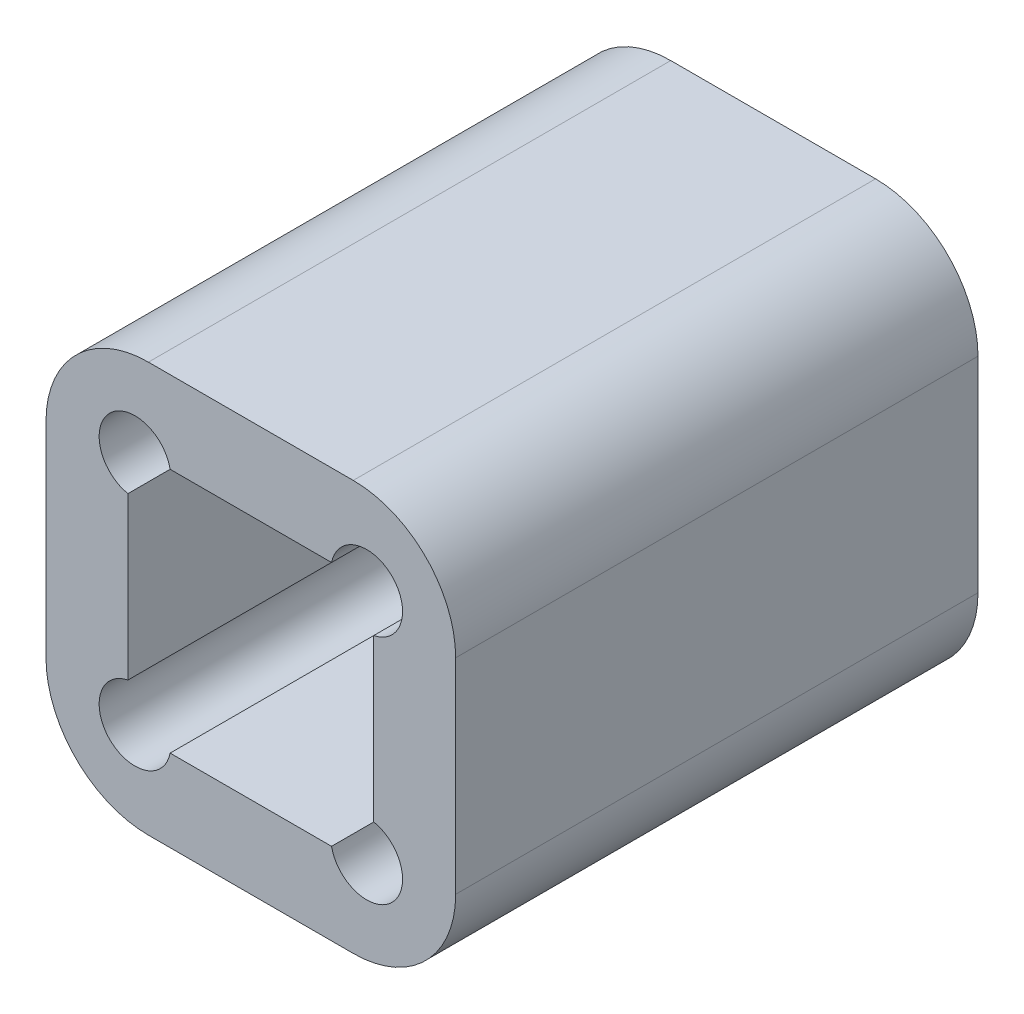
ISO-10303-21;
HEADER;
FILE_DESCRIPTION(('STEP AP214'),'2;1');
FILE_NAME('part.step','',(''),(''),'','','');
FILE_SCHEMA(('AUTOMOTIVE_DESIGN { 1 0 10303 214 1 1 1 1 }'));
ENDSEC;
DATA;
#1=APPLICATION_CONTEXT('core data for automotive mechanical design processes');
#2=APPLICATION_PROTOCOL_DEFINITION('international standard','automotive_design',2000,#1);
#3=PRODUCT_CONTEXT('',#1,'mechanical');
#4=PRODUCT('Part','Part','',(#3));
#5=PRODUCT_RELATED_PRODUCT_CATEGORY('part','',(#4));
#6=PRODUCT_DEFINITION_FORMATION('','',#4);
#7=PRODUCT_DEFINITION_CONTEXT('part definition',#1,'design');
#8=PRODUCT_DEFINITION('design','',#6,#7);
#9=PRODUCT_DEFINITION_SHAPE('','',#8);
#10=(LENGTH_UNIT() NAMED_UNIT(*) SI_UNIT(.MILLI.,.METRE.));
#11=(NAMED_UNIT(*) PLANE_ANGLE_UNIT() SI_UNIT($,.RADIAN.));
#12=(NAMED_UNIT(*) SI_UNIT($,.STERADIAN.) SOLID_ANGLE_UNIT());
#13=UNCERTAINTY_MEASURE_WITH_UNIT(LENGTH_MEASURE(1.E-05),#10,'distance_accuracy_value','');
#14=(GEOMETRIC_REPRESENTATION_CONTEXT(3) GLOBAL_UNCERTAINTY_ASSIGNED_CONTEXT((#13)) GLOBAL_UNIT_ASSIGNED_CONTEXT((#10,
#11,#12)) REPRESENTATION_CONTEXT('',''));
#15=CARTESIAN_POINT('',(0.,0.,0.));
#16=DIRECTION('',(0.,0.,1.));
#17=DIRECTION('',(1.,0.,0.));
#18=AXIS2_PLACEMENT_3D('',#15,#16,#17);
#19=CARTESIAN_POINT('',(0.,0.,0.));
#20=DIRECTION('',(0.,0.,-1.));
#21=DIRECTION('',(-1.,0.,0.));
#22=AXIS2_PLACEMENT_3D('',#19,#20,#21);
#23=CONICAL_SURFACE('',#22,3.15,0.785398163397448);
#24=CARTESIAN_POINT('',(0.,0.,1.45));
#25=DIRECTION('',(0.,0.,-1.));
#26=DIRECTION('',(-1.,0.,0.));
#27=AXIS2_PLACEMENT_3D('',#24,#25,#26);
#28=CIRCLE('',#27,1.7);
#29=CARTESIAN_POINT('',(1.7,0.,1.45));
#30=VERTEX_POINT('',#29);
#31=CARTESIAN_POINT('',(-1.7,0.,1.45));
#32=VERTEX_POINT('',#31);
#33=EDGE_CURVE('E41',#30,#32,#28,.T.);
#34=ORIENTED_EDGE('',*,*,#33,.F.);
#35=DIRECTION('',(0.707106781186547,0.,-0.707106781186548));
#36=VECTOR('',#35,1.);
#37=CARTESIAN_POINT('',(3.15,0.,0.));
#38=LINE('',#37,#36);
#39=CARTESIAN_POINT('',(3.15,0.,0.));
#40=VERTEX_POINT('',#39);
#41=EDGE_CURVE('E11',#30,#40,#38,.T.);
#42=ORIENTED_EDGE('',*,*,#41,.T.);
#43=CARTESIAN_POINT('',(0.,0.,0.));
#44=DIRECTION('',(0.,0.,-1.));
#45=DIRECTION('',(-1.,0.,0.));
#46=AXIS2_PLACEMENT_3D('',#43,#44,#45);
#47=CIRCLE('',#46,3.15);
#48=CARTESIAN_POINT('',(-3.15,0.,0.));
#49=VERTEX_POINT('',#48);
#50=EDGE_CURVE('E27',#40,#49,#47,.T.);
#51=ORIENTED_EDGE('',*,*,#50,.T.);
#52=DIRECTION('',(-0.707106781186547,0.,-0.707106781186548));
#53=VECTOR('',#52,1.);
#54=CARTESIAN_POINT('',(-3.15,0.,0.));
#55=LINE('',#54,#53);
#56=EDGE_CURVE('E209',#32,#49,#55,.T.);
#57=ORIENTED_EDGE('',*,*,#56,.F.);
#58=EDGE_LOOP('',(#34,#42,#51,#57));
#59=FACE_BOUND('',#58,.T.);
#60=ADVANCED_FACE('F16',(#59),#23,.F.);
#61=CARTESIAN_POINT('',(0.,0.,0.));
#62=DIRECTION('',(0.,0.,-1.));
#63=DIRECTION('',(-1.,0.,0.));
#64=AXIS2_PLACEMENT_3D('',#61,#62,#63);
#65=CYLINDRICAL_SURFACE('',#64,1.7);
#66=CARTESIAN_POINT('',(0.,0.,4.75));
#67=DIRECTION('',(0.,0.,-1.));
#68=DIRECTION('',(-1.,0.,0.));
#69=AXIS2_PLACEMENT_3D('',#66,#67,#68);
#70=CIRCLE('',#69,1.7);
#71=CARTESIAN_POINT('',(1.7,0.,4.75));
#72=VERTEX_POINT('',#71);
#73=CARTESIAN_POINT('',(-1.7,0.,4.75));
#74=VERTEX_POINT('',#73);
#75=EDGE_CURVE('E275',#72,#74,#70,.T.);
#76=ORIENTED_EDGE('',*,*,#75,.F.);
#77=DIRECTION('',(0.,0.,-1.));
#78=VECTOR('',#77,1.);
#79=CARTESIAN_POINT('',(1.7,0.,0.));
#80=LINE('',#79,#78);
#81=EDGE_CURVE('E234',#72,#30,#80,.T.);
#82=ORIENTED_EDGE('',*,*,#81,.T.);
#83=ORIENTED_EDGE('',*,*,#33,.T.);
#84=DIRECTION('',(0.,0.,-1.));
#85=VECTOR('',#84,1.);
#86=CARTESIAN_POINT('',(-1.7,0.,0.));
#87=LINE('',#86,#85);
#88=EDGE_CURVE('E223',#74,#32,#87,.T.);
#89=ORIENTED_EDGE('',*,*,#88,.F.);
#90=EDGE_LOOP('',(#76,#82,#83,#89));
#91=FACE_BOUND('',#90,.T.);
#92=ADVANCED_FACE('F233',(#91),#65,.F.);
#93=CARTESIAN_POINT('',(2.82842712474619,-2.82842712474619,2.27512626584708));
#94=DIRECTION('',(0.,0.,1.));
#95=DIRECTION('',(1.,0.,0.));
#96=AXIS2_PLACEMENT_3D('',#93,#94,#95);
#97=CYLINDRICAL_SURFACE('',#96,0.875);
#98=CARTESIAN_POINT('',(2.82842712474619,-2.82842712474619,4.75));
#99=DIRECTION('',(0.,0.,1.));
#100=DIRECTION('',(-1.,0.,0.));
#101=AXIS2_PLACEMENT_3D('',#98,#99,#100);
#102=CIRCLE('',#101,0.875);
#103=CARTESIAN_POINT('',(3.70342712474619,-2.82842712474619,4.75));
#104=VERTEX_POINT('',#103);
#105=CARTESIAN_POINT('',(3.,-1.97041328541891,4.75));
#106=VERTEX_POINT('',#105);
#107=EDGE_CURVE('E333',#104,#106,#102,.T.);
#108=ORIENTED_EDGE('',*,*,#107,.F.);
#109=DIRECTION('',(0.,0.,1.));
#110=VECTOR('',#109,1.);
#111=CARTESIAN_POINT('',(3.70342712474619,-2.82842712474619,2.27512626584708));
#112=LINE('',#111,#110);
#113=CARTESIAN_POINT('',(3.70342712474619,-2.82842712474619,12.75));
#114=VERTEX_POINT('',#113);
#115=EDGE_CURVE('E237',#104,#114,#112,.T.);
#116=ORIENTED_EDGE('',*,*,#115,.T.);
#117=CARTESIAN_POINT('',(2.82842712474619,-2.82842712474619,12.75));
#118=DIRECTION('',(0.,0.,1.));
#119=DIRECTION('',(1.,0.,0.));
#120=AXIS2_PLACEMENT_3D('',#117,#118,#119);
#121=CIRCLE('',#120,0.875);
#122=CARTESIAN_POINT('',(3.,-1.97041328541891,12.75));
#123=VERTEX_POINT('',#122);
#124=EDGE_CURVE('E250',#114,#123,#121,.T.);
#125=ORIENTED_EDGE('',*,*,#124,.T.);
#126=DIRECTION('',(0.,0.,1.));
#127=VECTOR('',#126,1.);
#128=CARTESIAN_POINT('',(3.,-1.97041328541891,2.27512626584708));
#129=LINE('',#128,#127);
#130=EDGE_CURVE('E344',#106,#123,#129,.T.);
#131=ORIENTED_EDGE('',*,*,#130,.F.);
#132=EDGE_LOOP('',(#108,#116,#125,#131));
#133=FACE_BOUND('',#132,.T.);
#134=ADVANCED_FACE('F482',(#133),#97,.F.);
#135=CARTESIAN_POINT('',(2.82842712474619,2.82842712474619,2.27512626584708));
#136=DIRECTION('',(0.,0.,1.));
#137=DIRECTION('',(1.,0.,0.));
#138=AXIS2_PLACEMENT_3D('',#135,#136,#137);
#139=CYLINDRICAL_SURFACE('',#138,0.875);
#140=CARTESIAN_POINT('',(2.82842712474619,2.82842712474619,4.75));
#141=DIRECTION('',(0.,0.,1.));
#142=DIRECTION('',(-1.,0.,0.));
#143=AXIS2_PLACEMENT_3D('',#140,#141,#142);
#144=CIRCLE('',#143,0.875);
#145=CARTESIAN_POINT('',(3.70342712474619,2.82842712474619,4.75));
#146=VERTEX_POINT('',#145);
#147=CARTESIAN_POINT('',(1.97041328541891,3.,4.75));
#148=VERTEX_POINT('',#147);
#149=EDGE_CURVE('E323',#146,#148,#144,.T.);
#150=ORIENTED_EDGE('',*,*,#149,.F.);
#151=DIRECTION('',(0.,0.,1.));
#152=VECTOR('',#151,1.);
#153=CARTESIAN_POINT('',(3.70342712474619,2.82842712474619,2.27512626584708));
#154=LINE('',#153,#152);
#155=CARTESIAN_POINT('',(3.70342712474619,2.82842712474619,12.75));
#156=VERTEX_POINT('',#155);
#157=EDGE_CURVE('E253',#146,#156,#154,.T.);
#158=ORIENTED_EDGE('',*,*,#157,.T.);
#159=CARTESIAN_POINT('',(2.82842712474619,2.82842712474619,12.75));
#160=DIRECTION('',(0.,0.,1.));
#161=DIRECTION('',(1.,0.,0.));
#162=AXIS2_PLACEMENT_3D('',#159,#160,#161);
#163=CIRCLE('',#162,0.875);
#164=CARTESIAN_POINT('',(1.97041328541891,3.,12.75));
#165=VERTEX_POINT('',#164);
#166=EDGE_CURVE('E309',#156,#165,#163,.T.);
#167=ORIENTED_EDGE('',*,*,#166,.T.);
#168=DIRECTION('',(0.,0.,1.));
#169=VECTOR('',#168,1.);
#170=CARTESIAN_POINT('',(1.97041328541891,3.,2.27512626584708));
#171=LINE('',#170,#169);
#172=EDGE_CURVE('E297',#148,#165,#171,.T.);
#173=ORIENTED_EDGE('',*,*,#172,.F.);
#174=EDGE_LOOP('',(#150,#158,#167,#173));
#175=FACE_BOUND('',#174,.T.);
#176=ADVANCED_FACE('F494',(#175),#139,.F.);
#177=CARTESIAN_POINT('',(-5.,5.,12.75));
#178=DIRECTION('',(1.,0.,0.));
#179=DIRECTION('',(0.,1.,0.));
#180=AXIS2_PLACEMENT_3D('',#177,#178,#179);
#181=PLANE('',#180);
#182=DIRECTION('',(0.,-1.,0.));
#183=VECTOR('',#182,1.);
#184=CARTESIAN_POINT('',(-5.,5.,0.));
#185=LINE('',#184,#183);
#186=CARTESIAN_POINT('',(-5.,2.5,0.));
#187=VERTEX_POINT('',#186);
#188=CARTESIAN_POINT('',(-5.,-2.5,0.));
#189=VERTEX_POINT('',#188);
#190=EDGE_CURVE('E305',#187,#189,#185,.T.);
#191=ORIENTED_EDGE('',*,*,#190,.T.);
#192=DIRECTION('',(0.,0.,1.));
#193=VECTOR('',#192,1.);
#194=CARTESIAN_POINT('',(-5.,-2.5,12.75));
#195=LINE('',#194,#193);
#196=CARTESIAN_POINT('',(-5.,-2.5,12.75));
#197=VERTEX_POINT('',#196);
#198=EDGE_CURVE('E310',#189,#197,#195,.T.);
#199=ORIENTED_EDGE('',*,*,#198,.T.);
#200=DIRECTION('',(0.,-1.,0.));
#201=VECTOR('',#200,1.);
#202=CARTESIAN_POINT('',(-5.,5.,12.75));
#203=LINE('',#202,#201);
#204=CARTESIAN_POINT('',(-5.,2.5,12.75));
#205=VERTEX_POINT('',#204);
#206=EDGE_CURVE('E283',#205,#197,#203,.T.);
#207=ORIENTED_EDGE('',*,*,#206,.F.);
#208=DIRECTION('',(0.,0.,-1.));
#209=VECTOR('',#208,1.);
#210=CARTESIAN_POINT('',(-5.,2.5,12.75));
#211=LINE('',#210,#209);
#212=EDGE_CURVE('E337',#205,#187,#211,.T.);
#213=ORIENTED_EDGE('',*,*,#212,.T.);
#214=EDGE_LOOP('',(#191,#199,#207,#213));
#215=FACE_BOUND('',#214,.T.);
#216=ADVANCED_FACE('F533',(#215),#181,.F.);
#217=CARTESIAN_POINT('',(5.,-5.,12.75));
#218=DIRECTION('',(0.,1.,0.));
#219=DIRECTION('',(1.,0.,0.));
#220=AXIS2_PLACEMENT_3D('',#217,#218,#219);
#221=PLANE('',#220);
#222=DIRECTION('',(1.,0.,0.));
#223=VECTOR('',#222,1.);
#224=CARTESIAN_POINT('',(5.,-5.,12.75));
#225=LINE('',#224,#223);
#226=CARTESIAN_POINT('',(-2.5,-5.,12.75));
#227=VERTEX_POINT('',#226);
#228=CARTESIAN_POINT('',(2.5,-5.,12.75));
#229=VERTEX_POINT('',#228);
#230=EDGE_CURVE('E301',#227,#229,#225,.T.);
#231=ORIENTED_EDGE('',*,*,#230,.F.);
#232=DIRECTION('',(0.,0.,-1.));
#233=VECTOR('',#232,1.);
#234=CARTESIAN_POINT('',(-2.5,-5.,12.75));
#235=LINE('',#234,#233);
#236=CARTESIAN_POINT('',(-2.5,-5.,0.));
#237=VERTEX_POINT('',#236);
#238=EDGE_CURVE('E384',#227,#237,#235,.T.);
#239=ORIENTED_EDGE('',*,*,#238,.T.);
#240=DIRECTION('',(1.,0.,0.));
#241=VECTOR('',#240,1.);
#242=CARTESIAN_POINT('',(5.,-5.,0.));
#243=LINE('',#242,#241);
#244=CARTESIAN_POINT('',(2.5,-5.,0.));
#245=VERTEX_POINT('',#244);
#246=EDGE_CURVE('E258',#237,#245,#243,.T.);
#247=ORIENTED_EDGE('',*,*,#246,.T.);
#248=DIRECTION('',(0.,0.,1.));
#249=VECTOR('',#248,1.);
#250=CARTESIAN_POINT('',(2.5,-5.,12.75));
#251=LINE('',#250,#249);
#252=EDGE_CURVE('E254',#245,#229,#251,.T.);
#253=ORIENTED_EDGE('',*,*,#252,.T.);
#254=EDGE_LOOP('',(#231,#239,#247,#253));
#255=FACE_BOUND('',#254,.T.);
#256=ADVANCED_FACE('F537',(#255),#221,.F.);
#257=CARTESIAN_POINT('',(5.,5.,12.75));
#258=DIRECTION('',(-1.,0.,0.));
#259=DIRECTION('',(0.,1.,0.));
#260=AXIS2_PLACEMENT_3D('',#257,#258,#259);
#261=PLANE('',#260);
#262=DIRECTION('',(0.,1.,0.));
#263=VECTOR('',#262,1.);
#264=CARTESIAN_POINT('',(5.,5.,0.));
#265=LINE('',#264,#263);
#266=CARTESIAN_POINT('',(5.,-2.5,0.));
#267=VERTEX_POINT('',#266);
#268=CARTESIAN_POINT('',(5.,2.5,0.));
#269=VERTEX_POINT('',#268);
#270=EDGE_CURVE('E259',#267,#269,#265,.T.);
#271=ORIENTED_EDGE('',*,*,#270,.T.);
#272=DIRECTION('',(0.,0.,1.));
#273=VECTOR('',#272,1.);
#274=CARTESIAN_POINT('',(5.,2.5,12.75));
#275=LINE('',#274,#273);
#276=CARTESIAN_POINT('',(5.,2.5,12.75));
#277=VERTEX_POINT('',#276);
#278=EDGE_CURVE('E326',#269,#277,#275,.T.);
#279=ORIENTED_EDGE('',*,*,#278,.T.);
#280=DIRECTION('',(0.,1.,0.));
#281=VECTOR('',#280,1.);
#282=CARTESIAN_POINT('',(5.,5.,12.75));
#283=LINE('',#282,#281);
#284=CARTESIAN_POINT('',(5.,-2.5,12.75));
#285=VERTEX_POINT('',#284);
#286=EDGE_CURVE('E130',#285,#277,#283,.T.);
#287=ORIENTED_EDGE('',*,*,#286,.F.);
#288=DIRECTION('',(0.,0.,-1.));
#289=VECTOR('',#288,1.);
#290=CARTESIAN_POINT('',(5.,-2.5,12.75));
#291=LINE('',#290,#289);
#292=EDGE_CURVE('E314',#285,#267,#291,.T.);
#293=ORIENTED_EDGE('',*,*,#292,.T.);
#294=EDGE_LOOP('',(#271,#279,#287,#293));
#295=FACE_BOUND('',#294,.T.);
#296=ADVANCED_FACE('F548',(#295),#261,.F.);
#297=CARTESIAN_POINT('',(5.,5.,12.75));
#298=DIRECTION('',(0.,-1.,0.));
#299=DIRECTION('',(0.,0.,-1.));
#300=AXIS2_PLACEMENT_3D('',#297,#298,#299);
#301=PLANE('',#300);
#302=DIRECTION('',(-1.,0.,0.));
#303=VECTOR('',#302,1.);
#304=CARTESIAN_POINT('',(5.,5.,0.));
#305=LINE('',#304,#303);
#306=CARTESIAN_POINT('',(2.5,5.,0.));
#307=VERTEX_POINT('',#306);
#308=CARTESIAN_POINT('',(-2.5,5.,0.));
#309=VERTEX_POINT('',#308);
#310=EDGE_CURVE('E264',#307,#309,#305,.T.);
#311=ORIENTED_EDGE('',*,*,#310,.T.);
#312=DIRECTION('',(0.,0.,1.));
#313=VECTOR('',#312,1.);
#314=CARTESIAN_POINT('',(-2.5,5.,12.75));
#315=LINE('',#314,#313);
#316=CARTESIAN_POINT('',(-2.5,5.,12.75));
#317=VERTEX_POINT('',#316);
#318=EDGE_CURVE('E260',#309,#317,#315,.T.);
#319=ORIENTED_EDGE('',*,*,#318,.T.);
#320=DIRECTION('',(-1.,0.,0.));
#321=VECTOR('',#320,1.);
#322=CARTESIAN_POINT('',(5.,5.,12.75));
#323=LINE('',#322,#321);
#324=CARTESIAN_POINT('',(2.5,5.,12.75));
#325=VERTEX_POINT('',#324);
#326=EDGE_CURVE('E266',#325,#317,#323,.T.);
#327=ORIENTED_EDGE('',*,*,#326,.F.);
#328=DIRECTION('',(0.,0.,-1.));
#329=VECTOR('',#328,1.);
#330=CARTESIAN_POINT('',(2.5,5.,12.75));
#331=LINE('',#330,#329);
#332=EDGE_CURVE('E265',#325,#307,#331,.T.);
#333=ORIENTED_EDGE('',*,*,#332,.T.);
#334=EDGE_LOOP('',(#311,#319,#327,#333));
#335=FACE_BOUND('',#334,.T.);
#336=ADVANCED_FACE('F632',(#335),#301,.F.);
#337=CARTESIAN_POINT('',(0.,0.,12.75));
#338=DIRECTION('',(0.,0.,-1.));
#339=DIRECTION('',(0.,-1.,0.));
#340=AXIS2_PLACEMENT_3D('',#337,#338,#339);
#341=PLANE('',#340);
#342=ORIENTED_EDGE('',*,*,#206,.T.);
#343=CARTESIAN_POINT('',(-2.5,-2.5,12.75));
#344=DIRECTION('',(0.,0.,1.));
#345=DIRECTION('',(-1.,0.,0.));
#346=AXIS2_PLACEMENT_3D('',#343,#344,#345);
#347=CIRCLE('',#346,2.5);
#348=EDGE_CURVE('E286',#197,#227,#347,.T.);
#349=ORIENTED_EDGE('',*,*,#348,.T.);
#350=ORIENTED_EDGE('',*,*,#230,.T.);
#351=CARTESIAN_POINT('',(2.5,-2.5,12.75));
#352=DIRECTION('',(0.,0.,1.));
#353=DIRECTION('',(-1.,0.,0.));
#354=AXIS2_PLACEMENT_3D('',#351,#352,#353);
#355=CIRCLE('',#354,2.5);
#356=EDGE_CURVE('E289',#229,#285,#355,.T.);
#357=ORIENTED_EDGE('',*,*,#356,.T.);
#358=ORIENTED_EDGE('',*,*,#286,.T.);
#359=CARTESIAN_POINT('',(2.5,2.5,12.75));
#360=DIRECTION('',(0.,0.,1.));
#361=DIRECTION('',(-1.,0.,0.));
#362=AXIS2_PLACEMENT_3D('',#359,#360,#361);
#363=CIRCLE('',#362,2.5);
#364=EDGE_CURVE('E268',#277,#325,#363,.T.);
#365=ORIENTED_EDGE('',*,*,#364,.T.);
#366=ORIENTED_EDGE('',*,*,#326,.T.);
#367=CARTESIAN_POINT('',(-2.5,2.5,12.75));
#368=DIRECTION('',(0.,0.,1.));
#369=DIRECTION('',(-1.,0.,0.));
#370=AXIS2_PLACEMENT_3D('',#367,#368,#369);
#371=CIRCLE('',#370,2.5);
#372=EDGE_CURVE('E269',#317,#205,#371,.T.);
#373=ORIENTED_EDGE('',*,*,#372,.T.);
#374=EDGE_LOOP('',(#342,#349,#350,#357,#358,#365,#366,#373));
#375=FACE_BOUND('',#374,.T.);
#376=DIRECTION('',(0.,1.,0.));
#377=VECTOR('',#376,1.);
#378=CARTESIAN_POINT('',(3.,-3.,12.75));
#379=LINE('',#378,#377);
#380=CARTESIAN_POINT('',(3.,1.97041328541891,12.75));
#381=VERTEX_POINT('',#380);
#382=EDGE_CURVE('E340',#123,#381,#379,.T.);
#383=ORIENTED_EDGE('',*,*,#382,.F.);
#384=ORIENTED_EDGE('',*,*,#124,.F.);
#385=CARTESIAN_POINT('',(2.82842712474619,-2.82842712474619,12.75));
#386=DIRECTION('',(0.,0.,1.));
#387=DIRECTION('',(1.,0.,0.));
#388=AXIS2_PLACEMENT_3D('',#385,#386,#387);
#389=CIRCLE('',#388,0.875);
#390=CARTESIAN_POINT('',(1.97041328541891,-3.,12.75));
#391=VERTEX_POINT('',#390);
#392=EDGE_CURVE('E231',#391,#114,#389,.T.);
#393=ORIENTED_EDGE('',*,*,#392,.F.);
#394=DIRECTION('',(1.,0.,0.));
#395=VECTOR('',#394,1.);
#396=CARTESIAN_POINT('',(-3.,-3.,12.75));
#397=LINE('',#396,#395);
#398=CARTESIAN_POINT('',(-1.97041328541891,-3.,12.75));
#399=VERTEX_POINT('',#398);
#400=EDGE_CURVE('E248',#399,#391,#397,.T.);
#401=ORIENTED_EDGE('',*,*,#400,.F.);
#402=CARTESIAN_POINT('',(-2.82842712474619,-2.82842712474619,12.75));
#403=DIRECTION('',(0.,0.,1.));
#404=DIRECTION('',(1.,0.,0.));
#405=AXIS2_PLACEMENT_3D('',#402,#403,#404);
#406=CIRCLE('',#405,0.875);
#407=CARTESIAN_POINT('',(-3.,-1.97041328541891,12.75));
#408=VERTEX_POINT('',#407);
#409=EDGE_CURVE('E278',#408,#399,#406,.T.);
#410=ORIENTED_EDGE('',*,*,#409,.F.);
#411=DIRECTION('',(0.,-1.,0.));
#412=VECTOR('',#411,1.);
#413=CARTESIAN_POINT('',(-3.,-3.,12.75));
#414=LINE('',#413,#412);
#415=CARTESIAN_POINT('',(-3.,1.97041328541891,12.75));
#416=VERTEX_POINT('',#415);
#417=EDGE_CURVE('E296',#416,#408,#414,.T.);
#418=ORIENTED_EDGE('',*,*,#417,.F.);
#419=CARTESIAN_POINT('',(-2.82842712474619,2.82842712474619,12.75));
#420=DIRECTION('',(0.,0.,1.));
#421=DIRECTION('',(1.,0.,0.));
#422=AXIS2_PLACEMENT_3D('',#419,#420,#421);
#423=CIRCLE('',#422,0.875);
#424=CARTESIAN_POINT('',(-1.97041328541891,3.,12.75));
#425=VERTEX_POINT('',#424);
#426=EDGE_CURVE('E304',#425,#416,#423,.T.);
#427=ORIENTED_EDGE('',*,*,#426,.F.);
#428=DIRECTION('',(-1.,0.,0.));
#429=VECTOR('',#428,1.);
#430=CARTESIAN_POINT('',(-3.,3.,12.75));
#431=LINE('',#430,#429);
#432=EDGE_CURVE('E20',#165,#425,#431,.T.);
#433=ORIENTED_EDGE('',*,*,#432,.F.);
#434=ORIENTED_EDGE('',*,*,#166,.F.);
#435=CARTESIAN_POINT('',(2.82842712474619,2.82842712474619,12.75));
#436=DIRECTION('',(0.,0.,1.));
#437=DIRECTION('',(1.,0.,0.));
#438=AXIS2_PLACEMENT_3D('',#435,#436,#437);
#439=CIRCLE('',#438,0.875);
#440=EDGE_CURVE('E274',#381,#156,#439,.T.);
#441=ORIENTED_EDGE('',*,*,#440,.F.);
#442=EDGE_LOOP('',(#383,#384,#393,#401,#410,#418,#427,#433,#434,#441));
#443=FACE_BOUND('',#442,.T.);
#444=ADVANCED_FACE('F18',(#375,#443),#341,.F.);
#445=CARTESIAN_POINT('',(0.,0.,0.));
#446=DIRECTION('',(0.,0.,-1.));
#447=DIRECTION('',(0.,-1.,0.));
#448=AXIS2_PLACEMENT_3D('',#445,#446,#447);
#449=PLANE('',#448);
#450=ORIENTED_EDGE('',*,*,#246,.F.);
#451=CARTESIAN_POINT('',(-2.5,-2.5,0.));
#452=DIRECTION('',(0.,0.,-1.));
#453=DIRECTION('',(-1.,0.,0.));
#454=AXIS2_PLACEMENT_3D('',#451,#452,#453);
#455=CIRCLE('',#454,2.5);
#456=EDGE_CURVE('E373',#237,#189,#455,.T.);
#457=ORIENTED_EDGE('',*,*,#456,.T.);
#458=ORIENTED_EDGE('',*,*,#190,.F.);
#459=CARTESIAN_POINT('',(-2.5,2.5,0.));
#460=DIRECTION('',(0.,0.,-1.));
#461=DIRECTION('',(-1.,0.,0.));
#462=AXIS2_PLACEMENT_3D('',#459,#460,#461);
#463=CIRCLE('',#462,2.5);
#464=EDGE_CURVE('E377',#187,#309,#463,.T.);
#465=ORIENTED_EDGE('',*,*,#464,.T.);
#466=ORIENTED_EDGE('',*,*,#310,.F.);
#467=CARTESIAN_POINT('',(2.5,2.5,0.));
#468=DIRECTION('',(0.,0.,-1.));
#469=DIRECTION('',(-1.,0.,0.));
#470=AXIS2_PLACEMENT_3D('',#467,#468,#469);
#471=CIRCLE('',#470,2.5);
#472=EDGE_CURVE('E407',#307,#269,#471,.T.);
#473=ORIENTED_EDGE('',*,*,#472,.T.);
#474=ORIENTED_EDGE('',*,*,#270,.F.);
#475=CARTESIAN_POINT('',(2.5,-2.5,0.));
#476=DIRECTION('',(0.,0.,-1.));
#477=DIRECTION('',(-1.,0.,0.));
#478=AXIS2_PLACEMENT_3D('',#475,#476,#477);
#479=CIRCLE('',#478,2.5);
#480=EDGE_CURVE('E403',#267,#245,#479,.T.);
#481=ORIENTED_EDGE('',*,*,#480,.T.);
#482=EDGE_LOOP('',(#450,#457,#458,#465,#466,#473,#474,#481));
#483=FACE_BOUND('',#482,.T.);
#484=CARTESIAN_POINT('',(0.,0.,0.));
#485=DIRECTION('',(0.,0.,-1.));
#486=DIRECTION('',(-1.,0.,0.));
#487=AXIS2_PLACEMENT_3D('',#484,#485,#486);
#488=CIRCLE('',#487,3.15);
#489=EDGE_CURVE('E217',#49,#40,#488,.T.);
#490=ORIENTED_EDGE('',*,*,#489,.F.);
#491=ORIENTED_EDGE('',*,*,#50,.F.);
#492=EDGE_LOOP('',(#490,#491));
#493=FACE_BOUND('',#492,.T.);
#494=ADVANCED_FACE('F511',(#483,#493),#449,.T.);
#495=CARTESIAN_POINT('',(3.,-3.,4.75));
#496=DIRECTION('',(1.,0.,0.));
#497=DIRECTION('',(0.,1.,0.));
#498=AXIS2_PLACEMENT_3D('',#495,#496,#497);
#499=PLANE('',#498);
#500=DIRECTION('',(0.,1.,0.));
#501=VECTOR('',#500,1.);
#502=CARTESIAN_POINT('',(3.,-3.,4.75));
#503=LINE('',#502,#501);
#504=CARTESIAN_POINT('',(3.,1.97041328541891,4.75));
#505=VERTEX_POINT('',#504);
#506=EDGE_CURVE('E330',#106,#505,#503,.T.);
#507=ORIENTED_EDGE('',*,*,#506,.F.);
#508=ORIENTED_EDGE('',*,*,#130,.T.);
#509=ORIENTED_EDGE('',*,*,#382,.T.);
#510=DIRECTION('',(0.,0.,-1.));
#511=VECTOR('',#510,1.);
#512=CARTESIAN_POINT('',(3.,1.97041328541891,2.27512626584708));
#513=LINE('',#512,#511);
#514=EDGE_CURVE('E345',#381,#505,#513,.T.);
#515=ORIENTED_EDGE('',*,*,#514,.T.);
#516=EDGE_LOOP('',(#507,#508,#509,#515));
#517=FACE_BOUND('',#516,.T.);
#518=ADVANCED_FACE('F486',(#517),#499,.F.);
#519=CARTESIAN_POINT('',(-3.,-3.,4.75));
#520=DIRECTION('',(0.,-1.,0.));
#521=DIRECTION('',(0.,0.,-1.));
#522=AXIS2_PLACEMENT_3D('',#519,#520,#521);
#523=PLANE('',#522);
#524=ORIENTED_EDGE('',*,*,#400,.T.);
#525=DIRECTION('',(0.,0.,-1.));
#526=VECTOR('',#525,1.);
#527=CARTESIAN_POINT('',(1.97041328541891,-3.,2.27512626584708));
#528=LINE('',#527,#526);
#529=CARTESIAN_POINT('',(1.97041328541891,-3.,4.75));
#530=VERTEX_POINT('',#529);
#531=EDGE_CURVE('E389',#391,#530,#528,.T.);
#532=ORIENTED_EDGE('',*,*,#531,.T.);
#533=DIRECTION('',(1.,0.,0.));
#534=VECTOR('',#533,1.);
#535=CARTESIAN_POINT('',(-3.,-3.,4.75));
#536=LINE('',#535,#534);
#537=CARTESIAN_POINT('',(-1.97041328541891,-3.,4.75));
#538=VERTEX_POINT('',#537);
#539=EDGE_CURVE('E279',#538,#530,#536,.T.);
#540=ORIENTED_EDGE('',*,*,#539,.F.);
#541=DIRECTION('',(0.,0.,1.));
#542=VECTOR('',#541,1.);
#543=CARTESIAN_POINT('',(-1.97041328541891,-3.,2.27512626584708));
#544=LINE('',#543,#542);
#545=EDGE_CURVE('E385',#538,#399,#544,.T.);
#546=ORIENTED_EDGE('',*,*,#545,.T.);
#547=EDGE_LOOP('',(#524,#532,#540,#546));
#548=FACE_BOUND('',#547,.T.);
#549=ADVANCED_FACE('F477',(#548),#523,.F.);
#550=CARTESIAN_POINT('',(-3.,-3.,4.75));
#551=DIRECTION('',(-1.,0.,0.));
#552=DIRECTION('',(0.,0.,1.));
#553=AXIS2_PLACEMENT_3D('',#550,#551,#552);
#554=PLANE('',#553);
#555=DIRECTION('',(0.,-1.,0.));
#556=VECTOR('',#555,1.);
#557=CARTESIAN_POINT('',(-3.,-3.,4.75));
#558=LINE('',#557,#556);
#559=CARTESIAN_POINT('',(-3.,1.97041328541891,4.75));
#560=VERTEX_POINT('',#559);
#561=CARTESIAN_POINT('',(-3.,-1.97041328541891,4.75));
#562=VERTEX_POINT('',#561);
#563=EDGE_CURVE('E320',#560,#562,#558,.T.);
#564=ORIENTED_EDGE('',*,*,#563,.F.);
#565=DIRECTION('',(0.,0.,1.));
#566=VECTOR('',#565,1.);
#567=CARTESIAN_POINT('',(-3.,1.97041328541891,2.27512626584708));
#568=LINE('',#567,#566);
#569=EDGE_CURVE('E390',#560,#416,#568,.T.);
#570=ORIENTED_EDGE('',*,*,#569,.T.);
#571=ORIENTED_EDGE('',*,*,#417,.T.);
#572=DIRECTION('',(0.,0.,-1.));
#573=VECTOR('',#572,1.);
#574=CARTESIAN_POINT('',(-3.,-1.97041328541891,2.27512626584708));
#575=LINE('',#574,#573);
#576=EDGE_CURVE('E292',#408,#562,#575,.T.);
#577=ORIENTED_EDGE('',*,*,#576,.T.);
#578=EDGE_LOOP('',(#564,#570,#571,#577));
#579=FACE_BOUND('',#578,.T.);
#580=ADVANCED_FACE('F434',(#579),#554,.F.);
#581=CARTESIAN_POINT('',(-3.,3.,4.75));
#582=DIRECTION('',(0.,1.,0.));
#583=DIRECTION('',(1.,0.,0.));
#584=AXIS2_PLACEMENT_3D('',#581,#582,#583);
#585=PLANE('',#584);
#586=DIRECTION('',(-1.,0.,0.));
#587=VECTOR('',#586,1.);
#588=CARTESIAN_POINT('',(-3.,3.,4.75));
#589=LINE('',#588,#587);
#590=CARTESIAN_POINT('',(-1.97041328541891,3.,4.75));
#591=VERTEX_POINT('',#590);
#592=EDGE_CURVE('E319',#148,#591,#589,.T.);
#593=ORIENTED_EDGE('',*,*,#592,.F.);
#594=ORIENTED_EDGE('',*,*,#172,.T.);
#595=ORIENTED_EDGE('',*,*,#432,.T.);
#596=DIRECTION('',(0.,0.,-1.));
#597=VECTOR('',#596,1.);
#598=CARTESIAN_POINT('',(-1.97041328541891,3.,2.27512626584708));
#599=LINE('',#598,#597);
#600=EDGE_CURVE('E363',#425,#591,#599,.T.);
#601=ORIENTED_EDGE('',*,*,#600,.T.);
#602=EDGE_LOOP('',(#593,#594,#595,#601));
#603=FACE_BOUND('',#602,.T.);
#604=ADVANCED_FACE('F499',(#603),#585,.F.);
#605=CARTESIAN_POINT('',(0.,0.,4.75));
#606=DIRECTION('',(0.,0.,-1.));
#607=DIRECTION('',(0.,-1.,0.));
#608=AXIS2_PLACEMENT_3D('',#605,#606,#607);
#609=PLANE('',#608);
#610=CARTESIAN_POINT('',(2.82842712474619,-2.82842712474619,4.75));
#611=DIRECTION('',(0.,0.,1.));
#612=DIRECTION('',(-1.,0.,0.));
#613=AXIS2_PLACEMENT_3D('',#610,#611,#612);
#614=CIRCLE('',#613,0.875);
#615=EDGE_CURVE('E354',#530,#104,#614,.T.);
#616=ORIENTED_EDGE('',*,*,#615,.T.);
#617=ORIENTED_EDGE('',*,*,#107,.T.);
#618=ORIENTED_EDGE('',*,*,#506,.T.);
#619=CARTESIAN_POINT('',(2.82842712474619,2.82842712474619,4.75));
#620=DIRECTION('',(0.,0.,1.));
#621=DIRECTION('',(-1.,0.,0.));
#622=AXIS2_PLACEMENT_3D('',#619,#620,#621);
#623=CIRCLE('',#622,0.875);
#624=EDGE_CURVE('E329',#505,#146,#623,.T.);
#625=ORIENTED_EDGE('',*,*,#624,.T.);
#626=ORIENTED_EDGE('',*,*,#149,.T.);
#627=ORIENTED_EDGE('',*,*,#592,.T.);
#628=CARTESIAN_POINT('',(-2.82842712474619,2.82842712474619,4.75));
#629=DIRECTION('',(0.,0.,1.));
#630=DIRECTION('',(-1.,0.,0.));
#631=AXIS2_PLACEMENT_3D('',#628,#629,#630);
#632=CIRCLE('',#631,0.875);
#633=EDGE_CURVE('E315',#591,#560,#632,.T.);
#634=ORIENTED_EDGE('',*,*,#633,.T.);
#635=ORIENTED_EDGE('',*,*,#563,.T.);
#636=CARTESIAN_POINT('',(-2.82842712474619,-2.82842712474619,4.75));
#637=DIRECTION('',(0.,0.,1.));
#638=DIRECTION('',(-1.,0.,0.));
#639=AXIS2_PLACEMENT_3D('',#636,#637,#638);
#640=CIRCLE('',#639,0.875);
#641=EDGE_CURVE('E282',#562,#538,#640,.T.);
#642=ORIENTED_EDGE('',*,*,#641,.T.);
#643=ORIENTED_EDGE('',*,*,#539,.T.);
#644=EDGE_LOOP('',(#616,#617,#618,#625,#626,#627,#634,#635,#642,#643));
#645=FACE_BOUND('',#644,.T.);
#646=CARTESIAN_POINT('',(0.,0.,4.75));
#647=DIRECTION('',(0.,0.,-1.));
#648=DIRECTION('',(-1.,0.,0.));
#649=AXIS2_PLACEMENT_3D('',#646,#647,#648);
#650=CIRCLE('',#649,1.7);
#651=EDGE_CURVE('E227',#74,#72,#650,.T.);
#652=ORIENTED_EDGE('',*,*,#651,.T.);
#653=ORIENTED_EDGE('',*,*,#75,.T.);
#654=EDGE_LOOP('',(#652,#653));
#655=FACE_BOUND('',#654,.T.);
#656=ADVANCED_FACE('F443',(#645,#655),#609,.F.);
#657=CARTESIAN_POINT('',(-2.82842712474619,-2.82842712474619,2.27512626584708));
#658=DIRECTION('',(0.,0.,1.));
#659=DIRECTION('',(1.,0.,0.));
#660=AXIS2_PLACEMENT_3D('',#657,#658,#659);
#661=CYLINDRICAL_SURFACE('',#660,0.875);
#662=ORIENTED_EDGE('',*,*,#641,.F.);
#663=ORIENTED_EDGE('',*,*,#576,.F.);
#664=ORIENTED_EDGE('',*,*,#409,.T.);
#665=ORIENTED_EDGE('',*,*,#545,.F.);
#666=EDGE_LOOP('',(#662,#663,#664,#665));
#667=FACE_BOUND('',#666,.T.);
#668=ADVANCED_FACE('F439',(#667),#661,.F.);
#669=CARTESIAN_POINT('',(-2.82842712474619,2.82842712474619,2.27512626584708));
#670=DIRECTION('',(0.,0.,1.));
#671=DIRECTION('',(1.,0.,0.));
#672=AXIS2_PLACEMENT_3D('',#669,#670,#671);
#673=CYLINDRICAL_SURFACE('',#672,0.875);
#674=ORIENTED_EDGE('',*,*,#633,.F.);
#675=ORIENTED_EDGE('',*,*,#600,.F.);
#676=ORIENTED_EDGE('',*,*,#426,.T.);
#677=ORIENTED_EDGE('',*,*,#569,.F.);
#678=EDGE_LOOP('',(#674,#675,#676,#677));
#679=FACE_BOUND('',#678,.T.);
#680=ADVANCED_FACE('F502',(#679),#673,.F.);
#681=CARTESIAN_POINT('',(2.82842712474619,2.82842712474619,2.27512626584708));
#682=DIRECTION('',(0.,0.,1.));
#683=DIRECTION('',(1.,0.,0.));
#684=AXIS2_PLACEMENT_3D('',#681,#682,#683);
#685=CYLINDRICAL_SURFACE('',#684,0.875);
#686=ORIENTED_EDGE('',*,*,#157,.F.);
#687=ORIENTED_EDGE('',*,*,#624,.F.);
#688=ORIENTED_EDGE('',*,*,#514,.F.);
#689=ORIENTED_EDGE('',*,*,#440,.T.);
#690=EDGE_LOOP('',(#686,#687,#688,#689));
#691=FACE_BOUND('',#690,.T.);
#692=ADVANCED_FACE('F492',(#691),#685,.F.);
#693=CARTESIAN_POINT('',(2.82842712474619,-2.82842712474619,2.27512626584708));
#694=DIRECTION('',(0.,0.,1.));
#695=DIRECTION('',(1.,0.,0.));
#696=AXIS2_PLACEMENT_3D('',#693,#694,#695);
#697=CYLINDRICAL_SURFACE('',#696,0.875);
#698=ORIENTED_EDGE('',*,*,#115,.F.);
#699=ORIENTED_EDGE('',*,*,#615,.F.);
#700=ORIENTED_EDGE('',*,*,#531,.F.);
#701=ORIENTED_EDGE('',*,*,#392,.T.);
#702=EDGE_LOOP('',(#698,#699,#700,#701));
#703=FACE_BOUND('',#702,.T.);
#704=ADVANCED_FACE('F480',(#703),#697,.F.);
#705=CARTESIAN_POINT('',(-2.5,-2.5,12.75));
#706=DIRECTION('',(0.,0.,-1.));
#707=DIRECTION('',(-1.,0.,0.));
#708=AXIS2_PLACEMENT_3D('',#705,#706,#707);
#709=CYLINDRICAL_SURFACE('',#708,2.5);
#710=ORIENTED_EDGE('',*,*,#348,.F.);
#711=ORIENTED_EDGE('',*,*,#198,.F.);
#712=ORIENTED_EDGE('',*,*,#456,.F.);
#713=ORIENTED_EDGE('',*,*,#238,.F.);
#714=EDGE_LOOP('',(#710,#711,#712,#713));
#715=FACE_BOUND('',#714,.T.);
#716=ADVANCED_FACE('F646',(#715),#709,.T.);
#717=CARTESIAN_POINT('',(-2.5,2.5,12.75));
#718=DIRECTION('',(0.,0.,-1.));
#719=DIRECTION('',(-1.,0.,0.));
#720=AXIS2_PLACEMENT_3D('',#717,#718,#719);
#721=CYLINDRICAL_SURFACE('',#720,2.5);
#722=ORIENTED_EDGE('',*,*,#372,.F.);
#723=ORIENTED_EDGE('',*,*,#318,.F.);
#724=ORIENTED_EDGE('',*,*,#464,.F.);
#725=ORIENTED_EDGE('',*,*,#212,.F.);
#726=EDGE_LOOP('',(#722,#723,#724,#725));
#727=FACE_BOUND('',#726,.T.);
#728=ADVANCED_FACE('F570',(#727),#721,.T.);
#729=CARTESIAN_POINT('',(2.5,2.5,12.75));
#730=DIRECTION('',(0.,0.,-1.));
#731=DIRECTION('',(-1.,0.,0.));
#732=AXIS2_PLACEMENT_3D('',#729,#730,#731);
#733=CYLINDRICAL_SURFACE('',#732,2.5);
#734=ORIENTED_EDGE('',*,*,#364,.F.);
#735=ORIENTED_EDGE('',*,*,#278,.F.);
#736=ORIENTED_EDGE('',*,*,#472,.F.);
#737=ORIENTED_EDGE('',*,*,#332,.F.);
#738=EDGE_LOOP('',(#734,#735,#736,#737));
#739=FACE_BOUND('',#738,.T.);
#740=ADVANCED_FACE('F565',(#739),#733,.T.);
#741=CARTESIAN_POINT('',(2.5,-2.5,12.75));
#742=DIRECTION('',(0.,0.,-1.));
#743=DIRECTION('',(-1.,0.,0.));
#744=AXIS2_PLACEMENT_3D('',#741,#742,#743);
#745=CYLINDRICAL_SURFACE('',#744,2.5);
#746=ORIENTED_EDGE('',*,*,#356,.F.);
#747=ORIENTED_EDGE('',*,*,#252,.F.);
#748=ORIENTED_EDGE('',*,*,#480,.F.);
#749=ORIENTED_EDGE('',*,*,#292,.F.);
#750=EDGE_LOOP('',(#746,#747,#748,#749));
#751=FACE_BOUND('',#750,.T.);
#752=ADVANCED_FACE('F569',(#751),#745,.T.);
#753=CARTESIAN_POINT('',(0.,0.,0.));
#754=DIRECTION('',(0.,0.,-1.));
#755=DIRECTION('',(-1.,0.,0.));
#756=AXIS2_PLACEMENT_3D('',#753,#754,#755);
#757=CYLINDRICAL_SURFACE('',#756,1.7);
#758=ORIENTED_EDGE('',*,*,#81,.F.);
#759=ORIENTED_EDGE('',*,*,#651,.F.);
#760=ORIENTED_EDGE('',*,*,#88,.T.);
#761=CARTESIAN_POINT('',(0.,0.,1.45));
#762=DIRECTION('',(0.,0.,-1.));
#763=DIRECTION('',(-1.,0.,0.));
#764=AXIS2_PLACEMENT_3D('',#761,#762,#763);
#765=CIRCLE('',#764,1.7);
#766=EDGE_CURVE('E216',#32,#30,#765,.T.);
#767=ORIENTED_EDGE('',*,*,#766,.T.);
#768=EDGE_LOOP('',(#758,#759,#760,#767));
#769=FACE_BOUND('',#768,.T.);
#770=ADVANCED_FACE('F225',(#769),#757,.F.);
#771=CARTESIAN_POINT('',(0.,0.,0.));
#772=DIRECTION('',(0.,0.,-1.));
#773=DIRECTION('',(-1.,0.,0.));
#774=AXIS2_PLACEMENT_3D('',#771,#772,#773);
#775=CONICAL_SURFACE('',#774,3.15,0.785398163397448);
#776=ORIENTED_EDGE('',*,*,#41,.F.);
#777=ORIENTED_EDGE('',*,*,#766,.F.);
#778=ORIENTED_EDGE('',*,*,#56,.T.);
#779=ORIENTED_EDGE('',*,*,#489,.T.);
#780=EDGE_LOOP('',(#776,#777,#778,#779));
#781=FACE_BOUND('',#780,.T.);
#782=ADVANCED_FACE('F239',(#781),#775,.F.);
#783=CLOSED_SHELL('',(#60,#92,#134,#176,#216,#256,#296,#336,#444,#494,#518,#549,#580,#604,#656,
#668,#680,#692,#704,#716,#728,#740,#752,#770,#782));
#784=MANIFOLD_SOLID_BREP('B1',#783);
#785=ADVANCED_BREP_SHAPE_REPRESENTATION('',(#18,#784),#14);
#786=SHAPE_DEFINITION_REPRESENTATION(#9,#785);
ENDSEC;
END-ISO-10303-21;
